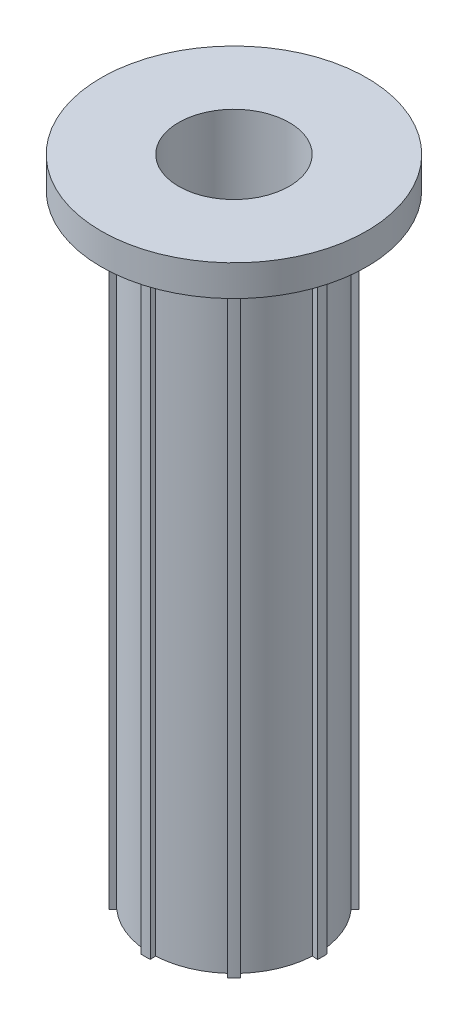
ISO-10303-21;
HEADER;
FILE_DESCRIPTION(('STEP AP214'),'2;1');
FILE_NAME('part.step','',(''),(''),'','','');
FILE_SCHEMA(('AUTOMOTIVE_DESIGN { 1 0 10303 214 1 1 1 1 }'));
ENDSEC;
DATA;
#1=APPLICATION_CONTEXT('core data for automotive mechanical design processes');
#2=APPLICATION_PROTOCOL_DEFINITION('international standard','automotive_design',2000,#1);
#3=PRODUCT_CONTEXT('',#1,'mechanical');
#4=PRODUCT('Part','Part','',(#3));
#5=PRODUCT_RELATED_PRODUCT_CATEGORY('part','',(#4));
#6=PRODUCT_DEFINITION_FORMATION('','',#4);
#7=PRODUCT_DEFINITION_CONTEXT('part definition',#1,'design');
#8=PRODUCT_DEFINITION('design','',#6,#7);
#9=PRODUCT_DEFINITION_SHAPE('','',#8);
#10=(LENGTH_UNIT() NAMED_UNIT(*) SI_UNIT(.MILLI.,.METRE.));
#11=(NAMED_UNIT(*) PLANE_ANGLE_UNIT() SI_UNIT($,.RADIAN.));
#12=(NAMED_UNIT(*) SI_UNIT($,.STERADIAN.) SOLID_ANGLE_UNIT());
#13=UNCERTAINTY_MEASURE_WITH_UNIT(LENGTH_MEASURE(1.E-05),#10,'distance_accuracy_value','');
#14=(GEOMETRIC_REPRESENTATION_CONTEXT(3) GLOBAL_UNCERTAINTY_ASSIGNED_CONTEXT((#13)) GLOBAL_UNIT_ASSIGNED_CONTEXT((#10,
#11,#12)) REPRESENTATION_CONTEXT('',''));
#15=CARTESIAN_POINT('',(0.,0.,0.));
#16=DIRECTION('',(0.,0.,1.));
#17=DIRECTION('',(1.,0.,0.));
#18=AXIS2_PLACEMENT_3D('',#15,#16,#17);
#19=CARTESIAN_POINT('',(0.,35.56,0.));
#20=DIRECTION('',(0.,-1.,0.));
#21=DIRECTION('',(0.,0.,-1.));
#22=AXIS2_PLACEMENT_3D('',#19,#20,#21);
#23=CYLINDRICAL_SURFACE('',#22,5.08);
#24=DIRECTION('',(0.,-1.,0.));
#25=VECTOR('',#24,1.);
#26=CARTESIAN_POINT('',(-3.39541124517394,35.56,3.77856883967281));
#27=LINE('',#26,#25);
#28=CARTESIAN_POINT('',(-3.39541124517394,35.56,3.77856883967281));
#29=VERTEX_POINT('',#28);
#30=CARTESIAN_POINT('',(-3.39541124517394,0.,3.77856883967281));
#31=VERTEX_POINT('',#30);
#32=EDGE_CURVE('E564',#29,#31,#27,.T.);
#33=ORIENTED_EDGE('',*,*,#32,.F.);
#34=CARTESIAN_POINT('',(0.,35.56,0.));
#35=DIRECTION('',(0.,1.,0.));
#36=DIRECTION('',(0.,0.,1.));
#37=AXIS2_PLACEMENT_3D('',#34,#35,#36);
#38=CIRCLE('',#37,5.08);
#39=CARTESIAN_POINT('',(-3.77856883967289,35.56,3.39541124517386));
#40=VERTEX_POINT('',#39);
#41=EDGE_CURVE('E308',#40,#29,#38,.T.);
#42=ORIENTED_EDGE('',*,*,#41,.F.);
#43=DIRECTION('',(0.,-1.,0.));
#44=VECTOR('',#43,1.);
#45=CARTESIAN_POINT('',(-3.77856883967289,35.56,3.39541124517386));
#46=LINE('',#45,#44);
#47=CARTESIAN_POINT('',(-3.77856883967289,0.,3.39541124517386));
#48=VERTEX_POINT('',#47);
#49=EDGE_CURVE('E339',#40,#48,#46,.T.);
#50=ORIENTED_EDGE('',*,*,#49,.T.);
#51=CARTESIAN_POINT('',(0.,0.,0.));
#52=DIRECTION('',(0.,1.,0.));
#53=DIRECTION('',(0.,0.,1.));
#54=AXIS2_PLACEMENT_3D('',#51,#52,#53);
#55=CIRCLE('',#54,5.08);
#56=EDGE_CURVE('E282',#48,#31,#55,.T.);
#57=ORIENTED_EDGE('',*,*,#56,.T.);
#58=EDGE_LOOP('',(#33,#42,#50,#57));
#59=FACE_BOUND('',#58,.T.);
#60=ADVANCED_FACE('F43',(#59),#23,.T.);
#61=DIRECTION('',(0.,-1.,0.));
#62=VECTOR('',#61,1.);
#63=CARTESIAN_POINT('',(-5.07276996609238,35.56,0.270933333333333));
#64=LINE('',#63,#62);
#65=CARTESIAN_POINT('',(-5.07276996609238,35.56,0.270933333333333));
#66=VERTEX_POINT('',#65);
#67=CARTESIAN_POINT('',(-5.07276996609238,0.,0.270933333333333));
#68=VERTEX_POINT('',#67);
#69=EDGE_CURVE('E463',#66,#68,#64,.T.);
#70=ORIENTED_EDGE('',*,*,#69,.F.);
#71=CARTESIAN_POINT('',(-5.07276996609238,35.56,-0.270933333333333));
#72=VERTEX_POINT('',#71);
#73=EDGE_CURVE('E273',#72,#66,#38,.T.);
#74=ORIENTED_EDGE('',*,*,#73,.F.);
#75=DIRECTION('',(0.,-1.,0.));
#76=VECTOR('',#75,1.);
#77=CARTESIAN_POINT('',(-5.07276996609238,35.56,-0.270933333333333));
#78=LINE('',#77,#76);
#79=CARTESIAN_POINT('',(-5.07276996609238,0.,-0.270933333333333));
#80=VERTEX_POINT('',#79);
#81=EDGE_CURVE('E260',#72,#80,#78,.T.);
#82=ORIENTED_EDGE('',*,*,#81,.T.);
#83=EDGE_CURVE('E275',#80,#68,#55,.T.);
#84=ORIENTED_EDGE('',*,*,#83,.T.);
#85=EDGE_LOOP('',(#70,#74,#82,#84));
#86=FACE_BOUND('',#85,.T.);
#87=ADVANCED_FACE('F271',(#86),#23,.T.);
#88=DIRECTION('',(0.,-1.,0.));
#89=VECTOR('',#88,1.);
#90=CARTESIAN_POINT('',(-0.270933333333333,35.56,-5.07276996609238));
#91=LINE('',#90,#89);
#92=CARTESIAN_POINT('',(-0.270933333333333,35.56,-5.07276996609238));
#93=VERTEX_POINT('',#92);
#94=CARTESIAN_POINT('',(-0.270933333333333,0.,-5.07276996609238));
#95=VERTEX_POINT('',#94);
#96=EDGE_CURVE('E324',#93,#95,#91,.T.);
#97=ORIENTED_EDGE('',*,*,#96,.F.);
#98=CARTESIAN_POINT('',(0.270933333333333,35.56,-5.07276996609238));
#99=VERTEX_POINT('',#98);
#100=EDGE_CURVE('E655',#99,#93,#38,.T.);
#101=ORIENTED_EDGE('',*,*,#100,.F.);
#102=DIRECTION('',(0.,-1.,0.));
#103=VECTOR('',#102,1.);
#104=CARTESIAN_POINT('',(0.270933333333333,35.56,-5.07276996609238));
#105=LINE('',#104,#103);
#106=CARTESIAN_POINT('',(0.270933333333333,0.,-5.07276996609238));
#107=VERTEX_POINT('',#106);
#108=EDGE_CURVE('E330',#99,#107,#105,.T.);
#109=ORIENTED_EDGE('',*,*,#108,.T.);
#110=EDGE_CURVE('E283',#107,#95,#55,.T.);
#111=ORIENTED_EDGE('',*,*,#110,.T.);
#112=EDGE_LOOP('',(#97,#101,#109,#111));
#113=FACE_BOUND('',#112,.T.);
#114=ADVANCED_FACE('F323',(#113),#23,.T.);
#115=DIRECTION('',(0.,-1.,0.));
#116=VECTOR('',#115,1.);
#117=CARTESIAN_POINT('',(3.39541124517386,35.56,-3.77856883967289));
#118=LINE('',#117,#116);
#119=CARTESIAN_POINT('',(3.39541124517386,35.56,-3.77856883967289));
#120=VERTEX_POINT('',#119);
#121=CARTESIAN_POINT('',(3.39541124517386,0.,-3.77856883967289));
#122=VERTEX_POINT('',#121);
#123=EDGE_CURVE('E356',#120,#122,#118,.T.);
#124=ORIENTED_EDGE('',*,*,#123,.F.);
#125=CARTESIAN_POINT('',(3.77856883967281,35.56,-3.39541124517394));
#126=VERTEX_POINT('',#125);
#127=EDGE_CURVE('E649',#126,#120,#38,.T.);
#128=ORIENTED_EDGE('',*,*,#127,.F.);
#129=DIRECTION('',(0.,-1.,0.));
#130=VECTOR('',#129,1.);
#131=CARTESIAN_POINT('',(3.77856883967281,35.56,-3.39541124517394));
#132=LINE('',#131,#130);
#133=CARTESIAN_POINT('',(3.77856883967281,0.,-3.39541124517394));
#134=VERTEX_POINT('',#133);
#135=EDGE_CURVE('E525',#126,#134,#132,.T.);
#136=ORIENTED_EDGE('',*,*,#135,.T.);
#137=EDGE_CURVE('E306',#134,#122,#55,.T.);
#138=ORIENTED_EDGE('',*,*,#137,.T.);
#139=EDGE_LOOP('',(#124,#128,#136,#138));
#140=FACE_BOUND('',#139,.T.);
#141=ADVANCED_FACE('F845',(#140),#23,.T.);
#142=CARTESIAN_POINT('',(-3.39541124517391,35.56,-3.77856883967284));
#143=VERTEX_POINT('',#142);
#144=CARTESIAN_POINT('',(-3.77856883967286,35.56,-3.39541124517389));
#145=VERTEX_POINT('',#144);
#146=EDGE_CURVE('E496',#143,#145,#38,.T.);
#147=ORIENTED_EDGE('',*,*,#146,.F.);
#148=DIRECTION('',(0.,-1.,0.));
#149=VECTOR('',#148,1.);
#150=CARTESIAN_POINT('',(-3.39541124517391,35.56,-3.77856883967284));
#151=LINE('',#150,#149);
#152=CARTESIAN_POINT('',(-3.39541124517391,0.,-3.77856883967284));
#153=VERTEX_POINT('',#152);
#154=EDGE_CURVE('E373',#143,#153,#151,.T.);
#155=ORIENTED_EDGE('',*,*,#154,.T.);
#156=CARTESIAN_POINT('',(-3.77856883967286,0.,-3.39541124517389));
#157=VERTEX_POINT('',#156);
#158=EDGE_CURVE('E278',#153,#157,#55,.T.);
#159=ORIENTED_EDGE('',*,*,#158,.T.);
#160=DIRECTION('',(0.,-1.,0.));
#161=VECTOR('',#160,1.);
#162=CARTESIAN_POINT('',(-3.77856883967286,35.56,-3.39541124517389));
#163=LINE('',#162,#161);
#164=EDGE_CURVE('E508',#145,#157,#163,.T.);
#165=ORIENTED_EDGE('',*,*,#164,.F.);
#166=EDGE_LOOP('',(#147,#155,#159,#165));
#167=FACE_BOUND('',#166,.T.);
#168=ADVANCED_FACE('F497',(#167),#23,.T.);
#169=DIRECTION('',(0.,-1.,0.));
#170=VECTOR('',#169,1.);
#171=CARTESIAN_POINT('',(5.07276996609238,35.56,-0.270933333333333));
#172=LINE('',#171,#170);
#173=CARTESIAN_POINT('',(5.07276996609238,35.56,-0.270933333333333));
#174=VERTEX_POINT('',#173);
#175=CARTESIAN_POINT('',(5.07276996609238,0.,-0.270933333333333));
#176=VERTEX_POINT('',#175);
#177=EDGE_CURVE('E514',#174,#176,#172,.T.);
#178=ORIENTED_EDGE('',*,*,#177,.F.);
#179=CARTESIAN_POINT('',(5.07276996609238,35.56,0.270933333333333));
#180=VERTEX_POINT('',#179);
#181=EDGE_CURVE('E55',#180,#174,#38,.T.);
#182=ORIENTED_EDGE('',*,*,#181,.F.);
#183=DIRECTION('',(0.,-1.,0.));
#184=VECTOR('',#183,1.);
#185=CARTESIAN_POINT('',(5.07276996609238,35.56,0.270933333333333));
#186=LINE('',#185,#184);
#187=CARTESIAN_POINT('',(5.07276996609238,0.,0.270933333333333));
#188=VERTEX_POINT('',#187);
#189=EDGE_CURVE('E550',#180,#188,#186,.T.);
#190=ORIENTED_EDGE('',*,*,#189,.T.);
#191=EDGE_CURVE('E296',#188,#176,#55,.T.);
#192=ORIENTED_EDGE('',*,*,#191,.T.);
#193=EDGE_LOOP('',(#178,#182,#190,#192));
#194=FACE_BOUND('',#193,.T.);
#195=ADVANCED_FACE('F443',(#194),#23,.T.);
#196=DIRECTION('',(0.,-1.,0.));
#197=VECTOR('',#196,1.);
#198=CARTESIAN_POINT('',(3.77856883967284,35.56,3.39541124517391));
#199=LINE('',#198,#197);
#200=CARTESIAN_POINT('',(3.77856883967284,35.56,3.39541124517391));
#201=VERTEX_POINT('',#200);
#202=CARTESIAN_POINT('',(3.77856883967284,0.,3.39541124517391));
#203=VERTEX_POINT('',#202);
#204=EDGE_CURVE('E537',#201,#203,#199,.T.);
#205=ORIENTED_EDGE('',*,*,#204,.F.);
#206=CARTESIAN_POINT('',(3.39541124517389,35.56,3.77856883967286));
#207=VERTEX_POINT('',#206);
#208=EDGE_CURVE('E11',#207,#201,#38,.T.);
#209=ORIENTED_EDGE('',*,*,#208,.F.);
#210=DIRECTION('',(0.,-1.,0.));
#211=VECTOR('',#210,1.);
#212=CARTESIAN_POINT('',(3.39541124517389,35.56,3.77856883967286));
#213=LINE('',#212,#211);
#214=CARTESIAN_POINT('',(3.39541124517389,0.,3.77856883967286));
#215=VERTEX_POINT('',#214);
#216=EDGE_CURVE('E398',#207,#215,#213,.T.);
#217=ORIENTED_EDGE('',*,*,#216,.T.);
#218=EDGE_CURVE('E292',#215,#203,#55,.T.);
#219=ORIENTED_EDGE('',*,*,#218,.T.);
#220=EDGE_LOOP('',(#205,#209,#217,#219));
#221=FACE_BOUND('',#220,.T.);
#222=ADVANCED_FACE('F442',(#221),#23,.T.);
#223=CARTESIAN_POINT('',(-0.270933333333333,35.56,5.07276996609238));
#224=VERTEX_POINT('',#223);
#225=CARTESIAN_POINT('',(0.270933333333333,35.56,5.07276996609238));
#226=VERTEX_POINT('',#225);
#227=EDGE_CURVE('E52',#224,#226,#38,.T.);
#228=ORIENTED_EDGE('',*,*,#227,.F.);
#229=DIRECTION('',(0.,-1.,0.));
#230=VECTOR('',#229,1.);
#231=CARTESIAN_POINT('',(-0.270933333333333,35.56,5.07276996609238));
#232=LINE('',#231,#230);
#233=CARTESIAN_POINT('',(-0.270933333333333,0.,5.07276996609238));
#234=VERTEX_POINT('',#233);
#235=EDGE_CURVE('E450',#224,#234,#232,.T.);
#236=ORIENTED_EDGE('',*,*,#235,.T.);
#237=CARTESIAN_POINT('',(0.270933333333333,0.,5.07276996609238));
#238=VERTEX_POINT('',#237);
#239=EDGE_CURVE('E50',#234,#238,#55,.T.);
#240=ORIENTED_EDGE('',*,*,#239,.T.);
#241=DIRECTION('',(0.,-1.,0.));
#242=VECTOR('',#241,1.);
#243=CARTESIAN_POINT('',(0.270933333333333,35.56,5.07276996609238));
#244=LINE('',#243,#242);
#245=EDGE_CURVE('E392',#226,#238,#244,.T.);
#246=ORIENTED_EDGE('',*,*,#245,.F.);
#247=EDGE_LOOP('',(#228,#236,#240,#246));
#248=FACE_BOUND('',#247,.T.);
#249=ADVANCED_FACE('F44',(#248),#23,.T.);
#250=CARTESIAN_POINT('',(0.,0.,0.));
#251=DIRECTION('',(0.,1.,0.));
#252=DIRECTION('',(0.,0.,1.));
#253=AXIS2_PLACEMENT_3D('',#250,#251,#252);
#254=PLANE('',#253);
#255=DIRECTION('',(0.998576764978815,0.,-0.0533333333333335));
#256=VECTOR('',#255,1.);
#257=CARTESIAN_POINT('',(-4.75572184321161,0.,0.254));
#258=LINE('',#257,#256);
#259=CARTESIAN_POINT('',(-4.75572184321161,0.,0.254000000000001));
#260=VERTEX_POINT('',#259);
#261=EDGE_CURVE('E67',#68,#260,#258,.T.);
#262=ORIENTED_EDGE('',*,*,#261,.F.);
#263=ORIENTED_EDGE('',*,*,#83,.F.);
#264=DIRECTION('',(-0.998576764978815,0.,-0.0533333333333335));
#265=VECTOR('',#264,1.);
#266=CARTESIAN_POINT('',(-4.75572184321161,0.,-0.254));
#267=LINE('',#266,#265);
#268=CARTESIAN_POINT('',(-4.75572184321161,0.,-0.254));
#269=VERTEX_POINT('',#268);
#270=EDGE_CURVE('E251',#269,#80,#267,.T.);
#271=ORIENTED_EDGE('',*,*,#270,.F.);
#272=CARTESIAN_POINT('',(0.,0.,0.));
#273=DIRECTION('',(0.,1.,0.));
#274=DIRECTION('',(0.,0.,-1.));
#275=AXIS2_PLACEMENT_3D('',#272,#273,#274);
#276=CIRCLE('',#275,4.7625);
#277=CARTESIAN_POINT('',(-3.54240828719331,0.,-3.18319804235052));
#278=VERTEX_POINT('',#277);
#279=EDGE_CURVE('E262',#278,#269,#276,.T.);
#280=ORIENTED_EDGE('',*,*,#279,.F.);
#281=DIRECTION('',(0.743812763715128,0.,0.668388040388563));
#282=VECTOR('',#281,1.);
#283=CARTESIAN_POINT('',(-3.54240828719331,0.,-3.18319804235052));
#284=LINE('',#283,#282);
#285=EDGE_CURVE('E364',#157,#278,#284,.T.);
#286=ORIENTED_EDGE('',*,*,#285,.F.);
#287=ORIENTED_EDGE('',*,*,#158,.F.);
#288=DIRECTION('',(-0.668388040388563,0.,-0.743812763715128));
#289=VECTOR('',#288,1.);
#290=CARTESIAN_POINT('',(-3.18319804235054,0.,-3.54240828719328));
#291=LINE('',#290,#289);
#292=CARTESIAN_POINT('',(-3.18319804235054,0.,-3.54240828719328));
#293=VERTEX_POINT('',#292);
#294=EDGE_CURVE('E342',#293,#153,#291,.T.);
#295=ORIENTED_EDGE('',*,*,#294,.F.);
#296=CARTESIAN_POINT('',(0.,0.,0.));
#297=DIRECTION('',(0.,1.,0.));
#298=DIRECTION('',(0.,0.,-1.));
#299=AXIS2_PLACEMENT_3D('',#296,#297,#298);
#300=CIRCLE('',#299,4.7625);
#301=CARTESIAN_POINT('',(-0.254,0.,-4.75572184321161));
#302=VERTEX_POINT('',#301);
#303=EDGE_CURVE('E337',#302,#293,#300,.T.);
#304=ORIENTED_EDGE('',*,*,#303,.F.);
#305=DIRECTION('',(0.0533333333333333,0.,0.998576764978815));
#306=VECTOR('',#305,1.);
#307=CARTESIAN_POINT('',(-0.254,0.,-4.75572184321161));
#308=LINE('',#307,#306);
#309=EDGE_CURVE('E334',#95,#302,#308,.T.);
#310=ORIENTED_EDGE('',*,*,#309,.F.);
#311=ORIENTED_EDGE('',*,*,#110,.F.);
#312=DIRECTION('',(0.0533333333333335,0.,-0.998576764978815));
#313=VECTOR('',#312,1.);
#314=CARTESIAN_POINT('',(0.254,0.,-4.75572184321161));
#315=LINE('',#314,#313);
#316=CARTESIAN_POINT('',(0.254,0.,-4.75572184321161));
#317=VERTEX_POINT('',#316);
#318=EDGE_CURVE('E332',#317,#107,#315,.T.);
#319=ORIENTED_EDGE('',*,*,#318,.F.);
#320=CARTESIAN_POINT('',(0.,0.,0.));
#321=DIRECTION('',(0.,1.,0.));
#322=DIRECTION('',(0.,0.,-1.));
#323=AXIS2_PLACEMENT_3D('',#320,#321,#322);
#324=CIRCLE('',#323,4.7625);
#325=CARTESIAN_POINT('',(3.18319804235049,0.,-3.54240828719333));
#326=VERTEX_POINT('',#325);
#327=EDGE_CURVE('E370',#326,#317,#324,.T.);
#328=ORIENTED_EDGE('',*,*,#327,.F.);
#329=DIRECTION('',(-0.668388040388562,0.,0.743812763715129));
#330=VECTOR('',#329,1.);
#331=CARTESIAN_POINT('',(3.18319804235049,0.,-3.54240828719333));
#332=LINE('',#331,#330);
#333=EDGE_CURVE('E371',#122,#326,#332,.T.);
#334=ORIENTED_EDGE('',*,*,#333,.F.);
#335=ORIENTED_EDGE('',*,*,#137,.F.);
#336=DIRECTION('',(0.743812763715128,0.,-0.668388040388563));
#337=VECTOR('',#336,1.);
#338=CARTESIAN_POINT('',(3.54240828719326,0.,-3.18319804235057));
#339=LINE('',#338,#337);
#340=CARTESIAN_POINT('',(3.54240828719326,0.,-3.18319804235057));
#341=VERTEX_POINT('',#340);
#342=EDGE_CURVE('E524',#341,#134,#339,.T.);
#343=ORIENTED_EDGE('',*,*,#342,.F.);
#344=CARTESIAN_POINT('',(0.,0.,0.));
#345=DIRECTION('',(0.,1.,0.));
#346=DIRECTION('',(0.,0.,-1.));
#347=AXIS2_PLACEMENT_3D('',#344,#345,#346);
#348=CIRCLE('',#347,4.7625);
#349=CARTESIAN_POINT('',(4.75572184321161,0.,-0.254));
#350=VERTEX_POINT('',#349);
#351=EDGE_CURVE('E527',#350,#341,#348,.T.);
#352=ORIENTED_EDGE('',*,*,#351,.F.);
#353=DIRECTION('',(-0.998576764978815,0.,0.0533333333333335));
#354=VECTOR('',#353,1.);
#355=CARTESIAN_POINT('',(5.07276996609238,0.,-0.270933333333333));
#356=LINE('',#355,#354);
#357=EDGE_CURVE('E274',#176,#350,#356,.T.);
#358=ORIENTED_EDGE('',*,*,#357,.F.);
#359=ORIENTED_EDGE('',*,*,#191,.F.);
#360=DIRECTION('',(0.998576764978815,0.,0.0533333333333335));
#361=VECTOR('',#360,1.);
#362=CARTESIAN_POINT('',(5.07276996609238,0.,0.270933333333333));
#363=LINE('',#362,#361);
#364=CARTESIAN_POINT('',(4.75572184321161,0.,0.254));
#365=VERTEX_POINT('',#364);
#366=EDGE_CURVE('E548',#365,#188,#363,.T.);
#367=ORIENTED_EDGE('',*,*,#366,.F.);
#368=CARTESIAN_POINT('',(0.,0.,0.));
#369=DIRECTION('',(0.,1.,0.));
#370=DIRECTION('',(0.,0.,-1.));
#371=AXIS2_PLACEMENT_3D('',#368,#369,#370);
#372=CIRCLE('',#371,4.7625);
#373=CARTESIAN_POINT('',(3.54240828719329,0.,3.18319804235054));
#374=VERTEX_POINT('',#373);
#375=EDGE_CURVE('E552',#374,#365,#372,.T.);
#376=ORIENTED_EDGE('',*,*,#375,.F.);
#377=DIRECTION('',(-0.743812763715128,0.,-0.668388040388563));
#378=VECTOR('',#377,1.);
#379=CARTESIAN_POINT('',(3.77856883967284,0.,3.39541124517391));
#380=LINE('',#379,#378);
#381=EDGE_CURVE('E523',#203,#374,#380,.T.);
#382=ORIENTED_EDGE('',*,*,#381,.F.);
#383=ORIENTED_EDGE('',*,*,#218,.F.);
#384=DIRECTION('',(0.668388040388563,0.,0.743812763715128));
#385=VECTOR('',#384,1.);
#386=CARTESIAN_POINT('',(3.39541124517389,0.,3.77856883967286));
#387=LINE('',#386,#385);
#388=CARTESIAN_POINT('',(3.18319804235052,0.,3.54240828719331));
#389=VERTEX_POINT('',#388);
#390=EDGE_CURVE('E384',#389,#215,#387,.T.);
#391=ORIENTED_EDGE('',*,*,#390,.F.);
#392=CARTESIAN_POINT('',(0.,0.,0.));
#393=DIRECTION('',(0.,1.,0.));
#394=DIRECTION('',(0.,0.,-1.));
#395=AXIS2_PLACEMENT_3D('',#392,#393,#394);
#396=CIRCLE('',#395,4.7625);
#397=CARTESIAN_POINT('',(0.254,0.,4.75572184321161));
#398=VERTEX_POINT('',#397);
#399=EDGE_CURVE('E394',#398,#389,#396,.T.);
#400=ORIENTED_EDGE('',*,*,#399,.F.);
#401=DIRECTION('',(-0.0533333333333334,0.,-0.998576764978815));
#402=VECTOR('',#401,1.);
#403=CARTESIAN_POINT('',(0.270933333333333,0.,5.07276996609238));
#404=LINE('',#403,#402);
#405=EDGE_CURVE('E395',#238,#398,#404,.T.);
#406=ORIENTED_EDGE('',*,*,#405,.F.);
#407=ORIENTED_EDGE('',*,*,#239,.F.);
#408=DIRECTION('',(-0.0533333333333334,0.,0.998576764978815));
#409=VECTOR('',#408,1.);
#410=CARTESIAN_POINT('',(-0.270933333333333,0.,5.07276996609238));
#411=LINE('',#410,#409);
#412=CARTESIAN_POINT('',(-0.254,0.,4.75572184321161));
#413=VERTEX_POINT('',#412);
#414=EDGE_CURVE('E569',#413,#234,#411,.T.);
#415=ORIENTED_EDGE('',*,*,#414,.F.);
#416=CARTESIAN_POINT('',(0.,0.,0.));
#417=DIRECTION('',(0.,1.,0.));
#418=DIRECTION('',(0.,0.,-1.));
#419=AXIS2_PLACEMENT_3D('',#416,#417,#418);
#420=CIRCLE('',#419,4.7625);
#421=CARTESIAN_POINT('',(-3.18319804235057,0.,3.54240828719326));
#422=VERTEX_POINT('',#421);
#423=EDGE_CURVE('E391',#422,#413,#420,.T.);
#424=ORIENTED_EDGE('',*,*,#423,.F.);
#425=DIRECTION('',(0.668388040388563,0.,-0.743812763715127));
#426=VECTOR('',#425,1.);
#427=CARTESIAN_POINT('',(-3.39541124517394,0.,3.77856883967281));
#428=LINE('',#427,#426);
#429=EDGE_CURVE('E58',#31,#422,#428,.T.);
#430=ORIENTED_EDGE('',*,*,#429,.F.);
#431=ORIENTED_EDGE('',*,*,#56,.F.);
#432=DIRECTION('',(-0.743812763715128,0.,0.668388040388563));
#433=VECTOR('',#432,1.);
#434=CARTESIAN_POINT('',(-3.77856883967289,0.,3.39541124517386));
#435=LINE('',#434,#433);
#436=CARTESIAN_POINT('',(-3.54240828719333,0.,3.18319804235049));
#437=VERTEX_POINT('',#436);
#438=EDGE_CURVE('E468',#437,#48,#435,.T.);
#439=ORIENTED_EDGE('',*,*,#438,.F.);
#440=CARTESIAN_POINT('',(0.,0.,0.));
#441=DIRECTION('',(0.,1.,0.));
#442=DIRECTION('',(0.,0.,-1.));
#443=AXIS2_PLACEMENT_3D('',#440,#441,#442);
#444=CIRCLE('',#443,4.7625);
#445=EDGE_CURVE('E473',#260,#437,#444,.T.);
#446=ORIENTED_EDGE('',*,*,#445,.F.);
#447=EDGE_LOOP('',(#262,#263,#271,#280,#286,#287,#295,#304,#310,#311,#319,#328,#334,#335,#343,
#352,#358,#359,#367,#376,#382,#383,#391,#400,#406,#407,#415,#424,#430,#431,#439,#446));
#448=FACE_BOUND('',#447,.T.);
#449=CARTESIAN_POINT('',(0.,0.,0.));
#450=DIRECTION('',(0.,1.,0.));
#451=DIRECTION('',(0.,0.,1.));
#452=AXIS2_PLACEMENT_3D('',#449,#450,#451);
#453=CIRCLE('',#452,3.175);
#454=CARTESIAN_POINT('',(0.,0.,3.175));
#455=VERTEX_POINT('',#454);
#456=EDGE_CURVE('E408',#455,#455,#453,.T.);
#457=ORIENTED_EDGE('',*,*,#456,.T.);
#458=EDGE_LOOP('',(#457));
#459=FACE_BOUND('',#458,.T.);
#460=ADVANCED_FACE('F280',(#448,#459),#254,.F.);
#461=CARTESIAN_POINT('',(0.,37.338,0.));
#462=DIRECTION('',(0.,-1.,0.));
#463=DIRECTION('',(0.,0.,-1.));
#464=AXIS2_PLACEMENT_3D('',#461,#462,#463);
#465=CYLINDRICAL_SURFACE('',#464,7.62);
#466=CARTESIAN_POINT('',(0.,37.338,0.));
#467=DIRECTION('',(0.,1.,0.));
#468=DIRECTION('',(0.,0.,1.));
#469=AXIS2_PLACEMENT_3D('',#466,#467,#468);
#470=CIRCLE('',#469,7.62);
#471=CARTESIAN_POINT('',(0.,37.338,7.62));
#472=VERTEX_POINT('',#471);
#473=EDGE_CURVE('E289',#472,#472,#470,.T.);
#474=ORIENTED_EDGE('',*,*,#473,.F.);
#475=EDGE_LOOP('',(#474));
#476=FACE_BOUND('',#475,.T.);
#477=CARTESIAN_POINT('',(0.,35.56,0.));
#478=DIRECTION('',(0.,1.,0.));
#479=DIRECTION('',(0.,0.,1.));
#480=AXIS2_PLACEMENT_3D('',#477,#478,#479);
#481=CIRCLE('',#480,7.62);
#482=CARTESIAN_POINT('',(0.,35.56,7.62));
#483=VERTEX_POINT('',#482);
#484=EDGE_CURVE('E300',#483,#483,#481,.T.);
#485=ORIENTED_EDGE('',*,*,#484,.T.);
#486=EDGE_LOOP('',(#485));
#487=FACE_BOUND('',#486,.T.);
#488=ADVANCED_FACE('F418',(#476,#487),#465,.T.);
#489=CARTESIAN_POINT('',(0.,37.338,0.));
#490=DIRECTION('',(0.,1.,0.));
#491=DIRECTION('',(0.,0.,1.));
#492=AXIS2_PLACEMENT_3D('',#489,#490,#491);
#493=PLANE('',#492);
#494=CARTESIAN_POINT('',(0.,37.338,0.));
#495=DIRECTION('',(0.,1.,0.));
#496=DIRECTION('',(0.,0.,1.));
#497=AXIS2_PLACEMENT_3D('',#494,#495,#496);
#498=CIRCLE('',#497,3.175);
#499=CARTESIAN_POINT('',(0.,37.338,3.175));
#500=VERTEX_POINT('',#499);
#501=EDGE_CURVE('E402',#500,#500,#498,.T.);
#502=ORIENTED_EDGE('',*,*,#501,.F.);
#503=EDGE_LOOP('',(#502));
#504=FACE_BOUND('',#503,.T.);
#505=ORIENTED_EDGE('',*,*,#473,.T.);
#506=EDGE_LOOP('',(#505));
#507=FACE_BOUND('',#506,.T.);
#508=ADVANCED_FACE('F423',(#504,#507),#493,.T.);
#509=CARTESIAN_POINT('',(0.,35.56,0.));
#510=DIRECTION('',(0.,1.,0.));
#511=DIRECTION('',(0.,0.,1.));
#512=AXIS2_PLACEMENT_3D('',#509,#510,#511);
#513=PLANE('',#512);
#514=ORIENTED_EDGE('',*,*,#227,.T.);
#515=DIRECTION('',(-0.0533333333333334,0.,-0.998576764978815));
#516=VECTOR('',#515,1.);
#517=CARTESIAN_POINT('',(0.270933333333333,35.56,5.07276996609238));
#518=LINE('',#517,#516);
#519=CARTESIAN_POINT('',(0.254,35.56,4.75572184321161));
#520=VERTEX_POINT('',#519);
#521=EDGE_CURVE('E381',#226,#520,#518,.T.);
#522=ORIENTED_EDGE('',*,*,#521,.T.);
#523=CARTESIAN_POINT('',(0.,35.56,0.));
#524=DIRECTION('',(0.,1.,0.));
#525=DIRECTION('',(0.,0.,-1.));
#526=AXIS2_PLACEMENT_3D('',#523,#524,#525);
#527=CIRCLE('',#526,4.7625);
#528=CARTESIAN_POINT('',(3.18319804235052,35.56,3.54240828719331));
#529=VERTEX_POINT('',#528);
#530=EDGE_CURVE('E383',#520,#529,#527,.T.);
#531=ORIENTED_EDGE('',*,*,#530,.T.);
#532=DIRECTION('',(0.668388040388563,0.,0.743812763715128));
#533=VECTOR('',#532,1.);
#534=CARTESIAN_POINT('',(3.39541124517389,35.56,3.77856883967286));
#535=LINE('',#534,#533);
#536=EDGE_CURVE('E389',#529,#207,#535,.T.);
#537=ORIENTED_EDGE('',*,*,#536,.T.);
#538=ORIENTED_EDGE('',*,*,#208,.T.);
#539=DIRECTION('',(-0.743812763715128,0.,-0.668388040388563));
#540=VECTOR('',#539,1.);
#541=CARTESIAN_POINT('',(3.77856883967284,35.56,3.39541124517391));
#542=LINE('',#541,#540);
#543=CARTESIAN_POINT('',(3.54240828719329,35.56,3.18319804235054));
#544=VERTEX_POINT('',#543);
#545=EDGE_CURVE('E555',#201,#544,#542,.T.);
#546=ORIENTED_EDGE('',*,*,#545,.T.);
#547=CARTESIAN_POINT('',(0.,35.56,0.));
#548=DIRECTION('',(0.,1.,0.));
#549=DIRECTION('',(0.,0.,-1.));
#550=AXIS2_PLACEMENT_3D('',#547,#548,#549);
#551=CIRCLE('',#550,4.7625);
#552=CARTESIAN_POINT('',(4.75572184321161,35.56,0.254));
#553=VERTEX_POINT('',#552);
#554=EDGE_CURVE('E558',#544,#553,#551,.T.);
#555=ORIENTED_EDGE('',*,*,#554,.T.);
#556=DIRECTION('',(0.998576764978815,0.,0.0533333333333335));
#557=VECTOR('',#556,1.);
#558=CARTESIAN_POINT('',(5.07276996609238,35.56,0.270933333333333));
#559=LINE('',#558,#557);
#560=EDGE_CURVE('E541',#553,#180,#559,.T.);
#561=ORIENTED_EDGE('',*,*,#560,.T.);
#562=ORIENTED_EDGE('',*,*,#181,.T.);
#563=DIRECTION('',(-0.998576764978815,0.,0.0533333333333335));
#564=VECTOR('',#563,1.);
#565=CARTESIAN_POINT('',(5.07276996609238,35.56,-0.270933333333333));
#566=LINE('',#565,#564);
#567=CARTESIAN_POINT('',(4.75572184321161,35.56,-0.254));
#568=VERTEX_POINT('',#567);
#569=EDGE_CURVE('E526',#174,#568,#566,.T.);
#570=ORIENTED_EDGE('',*,*,#569,.T.);
#571=CARTESIAN_POINT('',(0.,35.56,0.));
#572=DIRECTION('',(0.,1.,0.));
#573=DIRECTION('',(0.,0.,-1.));
#574=AXIS2_PLACEMENT_3D('',#571,#572,#573);
#575=CIRCLE('',#574,4.7625);
#576=CARTESIAN_POINT('',(3.54240828719326,35.56,-3.18319804235057));
#577=VERTEX_POINT('',#576);
#578=EDGE_CURVE('E534',#568,#577,#575,.T.);
#579=ORIENTED_EDGE('',*,*,#578,.T.);
#580=DIRECTION('',(0.743812763715128,0.,-0.668388040388563));
#581=VECTOR('',#580,1.);
#582=CARTESIAN_POINT('',(3.54240828719326,35.56,-3.18319804235057));
#583=LINE('',#582,#581);
#584=EDGE_CURVE('E517',#577,#126,#583,.T.);
#585=ORIENTED_EDGE('',*,*,#584,.T.);
#586=ORIENTED_EDGE('',*,*,#127,.T.);
#587=DIRECTION('',(-0.668388040388562,0.,0.743812763715129));
#588=VECTOR('',#587,1.);
#589=CARTESIAN_POINT('',(3.18319804235049,35.56,-3.54240828719333));
#590=LINE('',#589,#588);
#591=CARTESIAN_POINT('',(3.18319804235049,35.56,-3.54240828719333));
#592=VERTEX_POINT('',#591);
#593=EDGE_CURVE('E366',#120,#592,#590,.T.);
#594=ORIENTED_EDGE('',*,*,#593,.T.);
#595=CARTESIAN_POINT('',(0.,35.56,0.));
#596=DIRECTION('',(0.,1.,0.));
#597=DIRECTION('',(0.,0.,-1.));
#598=AXIS2_PLACEMENT_3D('',#595,#596,#597);
#599=CIRCLE('',#598,4.7625);
#600=CARTESIAN_POINT('',(0.254,35.56,-4.75572184321161));
#601=VERTEX_POINT('',#600);
#602=EDGE_CURVE('E376',#592,#601,#599,.T.);
#603=ORIENTED_EDGE('',*,*,#602,.T.);
#604=DIRECTION('',(0.0533333333333335,0.,-0.998576764978815));
#605=VECTOR('',#604,1.);
#606=CARTESIAN_POINT('',(0.254,35.56,-4.75572184321161));
#607=LINE('',#606,#605);
#608=EDGE_CURVE('E357',#601,#99,#607,.T.);
#609=ORIENTED_EDGE('',*,*,#608,.T.);
#610=ORIENTED_EDGE('',*,*,#100,.T.);
#611=DIRECTION('',(0.0533333333333333,0.,0.998576764978815));
#612=VECTOR('',#611,1.);
#613=CARTESIAN_POINT('',(-0.254,35.56,-4.75572184321161));
#614=LINE('',#613,#612);
#615=CARTESIAN_POINT('',(-0.254,35.56,-4.75572184321161));
#616=VERTEX_POINT('',#615);
#617=EDGE_CURVE('E353',#93,#616,#614,.T.);
#618=ORIENTED_EDGE('',*,*,#617,.T.);
#619=CARTESIAN_POINT('',(0.,35.56,0.));
#620=DIRECTION('',(0.,1.,0.));
#621=DIRECTION('',(0.,0.,-1.));
#622=AXIS2_PLACEMENT_3D('',#619,#620,#621);
#623=CIRCLE('',#622,4.7625);
#624=CARTESIAN_POINT('',(-3.18319804235054,35.56,-3.54240828719328));
#625=VERTEX_POINT('',#624);
#626=EDGE_CURVE('E348',#616,#625,#623,.T.);
#627=ORIENTED_EDGE('',*,*,#626,.T.);
#628=DIRECTION('',(-0.668388040388563,0.,-0.743812763715128));
#629=VECTOR('',#628,1.);
#630=CARTESIAN_POINT('',(-3.18319804235054,35.56,-3.54240828719328));
#631=LINE('',#630,#629);
#632=EDGE_CURVE('E350',#625,#143,#631,.T.);
#633=ORIENTED_EDGE('',*,*,#632,.T.);
#634=ORIENTED_EDGE('',*,*,#146,.T.);
#635=DIRECTION('',(0.743812763715128,0.,0.668388040388563));
#636=VECTOR('',#635,1.);
#637=CARTESIAN_POINT('',(-3.54240828719331,35.56,-3.18319804235052));
#638=LINE('',#637,#636);
#639=CARTESIAN_POINT('',(-3.54240828719331,35.56,-3.18319804235052));
#640=VERTEX_POINT('',#639);
#641=EDGE_CURVE('E264',#145,#640,#638,.T.);
#642=ORIENTED_EDGE('',*,*,#641,.T.);
#643=CARTESIAN_POINT('',(0.,35.56,0.));
#644=DIRECTION('',(0.,1.,0.));
#645=DIRECTION('',(0.,0.,-1.));
#646=AXIS2_PLACEMENT_3D('',#643,#644,#645);
#647=CIRCLE('',#646,4.7625);
#648=CARTESIAN_POINT('',(-4.75572184321161,35.56,-0.254));
#649=VERTEX_POINT('',#648);
#650=EDGE_CURVE('E507',#640,#649,#647,.T.);
#651=ORIENTED_EDGE('',*,*,#650,.T.);
#652=DIRECTION('',(-0.998576764978815,0.,-0.0533333333333335));
#653=VECTOR('',#652,1.);
#654=CARTESIAN_POINT('',(-4.75572184321161,35.56,-0.254));
#655=LINE('',#654,#653);
#656=EDGE_CURVE('E506',#649,#72,#655,.T.);
#657=ORIENTED_EDGE('',*,*,#656,.T.);
#658=ORIENTED_EDGE('',*,*,#73,.T.);
#659=DIRECTION('',(0.998576764978815,0.,-0.0533333333333335));
#660=VECTOR('',#659,1.);
#661=CARTESIAN_POINT('',(-4.75572184321161,35.56,0.254));
#662=LINE('',#661,#660);
#663=CARTESIAN_POINT('',(-4.75572184321161,35.56,0.254000000000001));
#664=VERTEX_POINT('',#663);
#665=EDGE_CURVE('E472',#66,#664,#662,.T.);
#666=ORIENTED_EDGE('',*,*,#665,.T.);
#667=CARTESIAN_POINT('',(0.,35.56,0.));
#668=DIRECTION('',(0.,1.,0.));
#669=DIRECTION('',(0.,0.,-1.));
#670=AXIS2_PLACEMENT_3D('',#667,#668,#669);
#671=CIRCLE('',#670,4.7625);
#672=CARTESIAN_POINT('',(-3.54240828719333,35.56,3.18319804235049));
#673=VERTEX_POINT('',#672);
#674=EDGE_CURVE('E479',#664,#673,#671,.T.);
#675=ORIENTED_EDGE('',*,*,#674,.T.);
#676=DIRECTION('',(-0.743812763715128,0.,0.668388040388563));
#677=VECTOR('',#676,1.);
#678=CARTESIAN_POINT('',(-3.77856883967289,35.56,3.39541124517386));
#679=LINE('',#678,#677);
#680=EDGE_CURVE('E461',#673,#40,#679,.T.);
#681=ORIENTED_EDGE('',*,*,#680,.T.);
#682=ORIENTED_EDGE('',*,*,#41,.T.);
#683=DIRECTION('',(0.668388040388563,0.,-0.743812763715127));
#684=VECTOR('',#683,1.);
#685=CARTESIAN_POINT('',(-3.39541124517394,35.56,3.77856883967281));
#686=LINE('',#685,#684);
#687=CARTESIAN_POINT('',(-3.18319804235057,35.56,3.54240828719326));
#688=VERTEX_POINT('',#687);
#689=EDGE_CURVE('E457',#29,#688,#686,.T.);
#690=ORIENTED_EDGE('',*,*,#689,.T.);
#691=CARTESIAN_POINT('',(0.,35.56,0.));
#692=DIRECTION('',(0.,1.,0.));
#693=DIRECTION('',(0.,0.,-1.));
#694=AXIS2_PLACEMENT_3D('',#691,#692,#693);
#695=CIRCLE('',#694,4.7625);
#696=CARTESIAN_POINT('',(-0.254,35.56,4.75572184321161));
#697=VERTEX_POINT('',#696);
#698=EDGE_CURVE('E453',#688,#697,#695,.T.);
#699=ORIENTED_EDGE('',*,*,#698,.T.);
#700=DIRECTION('',(-0.0533333333333334,0.,0.998576764978815));
#701=VECTOR('',#700,1.);
#702=CARTESIAN_POINT('',(-0.270933333333333,35.56,5.07276996609238));
#703=LINE('',#702,#701);
#704=EDGE_CURVE('E451',#697,#224,#703,.T.);
#705=ORIENTED_EDGE('',*,*,#704,.T.);
#706=EDGE_LOOP('',(#514,#522,#531,#537,#538,#546,#555,#561,#562,#570,#579,#585,#586,#594,#603,
#609,#610,#618,#627,#633,#634,#642,#651,#657,#658,#666,#675,#681,#682,#690,#699,#705));
#707=FACE_BOUND('',#706,.T.);
#708=ORIENTED_EDGE('',*,*,#484,.F.);
#709=EDGE_LOOP('',(#708));
#710=FACE_BOUND('',#709,.T.);
#711=ADVANCED_FACE('F416',(#707,#710),#513,.F.);
#712=CARTESIAN_POINT('',(0.,0.,0.));
#713=DIRECTION('',(0.,1.,0.));
#714=DIRECTION('',(0.,0.,1.));
#715=AXIS2_PLACEMENT_3D('',#712,#713,#714);
#716=CYLINDRICAL_SURFACE('',#715,3.175);
#717=ORIENTED_EDGE('',*,*,#456,.F.);
#718=EDGE_LOOP('',(#717));
#719=FACE_BOUND('',#718,.T.);
#720=ORIENTED_EDGE('',*,*,#501,.T.);
#721=EDGE_LOOP('',(#720));
#722=FACE_BOUND('',#721,.T.);
#723=ADVANCED_FACE('F419',(#719,#722),#716,.F.);
#724=CARTESIAN_POINT('',(3.39541124517389,35.56,3.77856883967286));
#725=DIRECTION('',(0.743812763715128,0.,-0.668388040388563));
#726=DIRECTION('',(-0.668388040388563,0.,-0.743812763715128));
#727=AXIS2_PLACEMENT_3D('',#724,#725,#726);
#728=PLANE('',#727);
#729=ORIENTED_EDGE('',*,*,#390,.T.);
#730=ORIENTED_EDGE('',*,*,#216,.F.);
#731=ORIENTED_EDGE('',*,*,#536,.F.);
#732=DIRECTION('',(0.,-1.,0.));
#733=VECTOR('',#732,1.);
#734=CARTESIAN_POINT('',(3.18319804235052,35.56,3.54240828719331));
#735=LINE('',#734,#733);
#736=EDGE_CURVE('E405',#529,#389,#735,.T.);
#737=ORIENTED_EDGE('',*,*,#736,.T.);
#738=EDGE_LOOP('',(#729,#730,#731,#737));
#739=FACE_BOUND('',#738,.T.);
#740=ADVANCED_FACE('F427',(#739),#728,.F.);
#741=CARTESIAN_POINT('',(0.,35.56,0.));
#742=DIRECTION('',(0.,-1.,0.));
#743=DIRECTION('',(0.,0.,-1.));
#744=AXIS2_PLACEMENT_3D('',#741,#742,#743);
#745=CYLINDRICAL_SURFACE('',#744,4.7625);
#746=ORIENTED_EDGE('',*,*,#399,.T.);
#747=ORIENTED_EDGE('',*,*,#736,.F.);
#748=ORIENTED_EDGE('',*,*,#530,.F.);
#749=DIRECTION('',(0.,-1.,0.));
#750=VECTOR('',#749,1.);
#751=CARTESIAN_POINT('',(0.254,35.56,4.75572184321161));
#752=LINE('',#751,#750);
#753=EDGE_CURVE('E404',#520,#398,#752,.T.);
#754=ORIENTED_EDGE('',*,*,#753,.T.);
#755=EDGE_LOOP('',(#746,#747,#748,#754));
#756=FACE_BOUND('',#755,.T.);
#757=ADVANCED_FACE('F622',(#756),#745,.T.);
#758=CARTESIAN_POINT('',(0.270933333333333,35.56,5.07276996609238));
#759=DIRECTION('',(-0.998576764978815,0.,0.0533333333333334));
#760=DIRECTION('',(0.0533333333333334,0.,0.998576764978815));
#761=AXIS2_PLACEMENT_3D('',#758,#759,#760);
#762=PLANE('',#761);
#763=ORIENTED_EDGE('',*,*,#405,.T.);
#764=ORIENTED_EDGE('',*,*,#753,.F.);
#765=ORIENTED_EDGE('',*,*,#521,.F.);
#766=ORIENTED_EDGE('',*,*,#245,.T.);
#767=EDGE_LOOP('',(#763,#764,#765,#766));
#768=FACE_BOUND('',#767,.T.);
#769=ADVANCED_FACE('F623',(#768),#762,.F.);
#770=CARTESIAN_POINT('',(5.07276996609238,35.56,0.270933333333333));
#771=DIRECTION('',(0.0533333333333335,0.,-0.998576764978815));
#772=DIRECTION('',(-0.998576764978815,0.,-0.0533333333333335));
#773=AXIS2_PLACEMENT_3D('',#770,#771,#772);
#774=PLANE('',#773);
#775=ORIENTED_EDGE('',*,*,#366,.T.);
#776=ORIENTED_EDGE('',*,*,#189,.F.);
#777=ORIENTED_EDGE('',*,*,#560,.F.);
#778=DIRECTION('',(0.,-1.,0.));
#779=VECTOR('',#778,1.);
#780=CARTESIAN_POINT('',(4.75572184321161,35.56,0.254));
#781=LINE('',#780,#779);
#782=EDGE_CURVE('E544',#553,#365,#781,.T.);
#783=ORIENTED_EDGE('',*,*,#782,.T.);
#784=EDGE_LOOP('',(#775,#776,#777,#783));
#785=FACE_BOUND('',#784,.T.);
#786=ADVANCED_FACE('F628',(#785),#774,.F.);
#787=CARTESIAN_POINT('',(0.,35.56,0.));
#788=DIRECTION('',(0.,-1.,0.));
#789=DIRECTION('',(0.,0.,-1.));
#790=AXIS2_PLACEMENT_3D('',#787,#788,#789);
#791=CYLINDRICAL_SURFACE('',#790,4.7625);
#792=ORIENTED_EDGE('',*,*,#375,.T.);
#793=ORIENTED_EDGE('',*,*,#782,.F.);
#794=ORIENTED_EDGE('',*,*,#554,.F.);
#795=DIRECTION('',(0.,-1.,0.));
#796=VECTOR('',#795,1.);
#797=CARTESIAN_POINT('',(3.54240828719329,35.56,3.18319804235054));
#798=LINE('',#797,#796);
#799=EDGE_CURVE('E545',#544,#374,#798,.T.);
#800=ORIENTED_EDGE('',*,*,#799,.T.);
#801=EDGE_LOOP('',(#792,#793,#794,#800));
#802=FACE_BOUND('',#801,.T.);
#803=ADVANCED_FACE('F632',(#802),#791,.T.);
#804=CARTESIAN_POINT('',(3.77856883967284,35.56,3.39541124517391));
#805=DIRECTION('',(-0.668388040388563,0.,0.743812763715128));
#806=DIRECTION('',(0.743812763715128,0.,0.668388040388563));
#807=AXIS2_PLACEMENT_3D('',#804,#805,#806);
#808=PLANE('',#807);
#809=ORIENTED_EDGE('',*,*,#381,.T.);
#810=ORIENTED_EDGE('',*,*,#799,.F.);
#811=ORIENTED_EDGE('',*,*,#545,.F.);
#812=ORIENTED_EDGE('',*,*,#204,.T.);
#813=EDGE_LOOP('',(#809,#810,#811,#812));
#814=FACE_BOUND('',#813,.T.);
#815=ADVANCED_FACE('F644',(#814),#808,.F.);
#816=CARTESIAN_POINT('',(3.54240828719326,35.56,-3.18319804235057));
#817=DIRECTION('',(-0.668388040388563,0.,-0.743812763715128));
#818=DIRECTION('',(-0.743812763715128,0.,0.668388040388563));
#819=AXIS2_PLACEMENT_3D('',#816,#817,#818);
#820=PLANE('',#819);
#821=ORIENTED_EDGE('',*,*,#342,.T.);
#822=ORIENTED_EDGE('',*,*,#135,.F.);
#823=ORIENTED_EDGE('',*,*,#584,.F.);
#824=DIRECTION('',(0.,-1.,0.));
#825=VECTOR('',#824,1.);
#826=CARTESIAN_POINT('',(3.54240828719326,35.56,-3.18319804235057));
#827=LINE('',#826,#825);
#828=EDGE_CURVE('E516',#577,#341,#827,.T.);
#829=ORIENTED_EDGE('',*,*,#828,.T.);
#830=EDGE_LOOP('',(#821,#822,#823,#829));
#831=FACE_BOUND('',#830,.T.);
#832=ADVANCED_FACE('F685',(#831),#820,.F.);
#833=CARTESIAN_POINT('',(0.,35.56,0.));
#834=DIRECTION('',(0.,-1.,0.));
#835=DIRECTION('',(0.,0.,-1.));
#836=AXIS2_PLACEMENT_3D('',#833,#834,#835);
#837=CYLINDRICAL_SURFACE('',#836,4.7625);
#838=ORIENTED_EDGE('',*,*,#351,.T.);
#839=ORIENTED_EDGE('',*,*,#828,.F.);
#840=ORIENTED_EDGE('',*,*,#578,.F.);
#841=DIRECTION('',(0.,-1.,0.));
#842=VECTOR('',#841,1.);
#843=CARTESIAN_POINT('',(4.75572184321161,35.56,-0.254));
#844=LINE('',#843,#842);
#845=EDGE_CURVE('E520',#568,#350,#844,.T.);
#846=ORIENTED_EDGE('',*,*,#845,.T.);
#847=EDGE_LOOP('',(#838,#839,#840,#846));
#848=FACE_BOUND('',#847,.T.);
#849=ADVANCED_FACE('F676',(#848),#837,.T.);
#850=CARTESIAN_POINT('',(5.07276996609238,35.56,-0.270933333333333));
#851=DIRECTION('',(0.0533333333333335,0.,0.998576764978815));
#852=DIRECTION('',(0.998576764978815,0.,-0.0533333333333335));
#853=AXIS2_PLACEMENT_3D('',#850,#851,#852);
#854=PLANE('',#853);
#855=ORIENTED_EDGE('',*,*,#357,.T.);
#856=ORIENTED_EDGE('',*,*,#845,.F.);
#857=ORIENTED_EDGE('',*,*,#569,.F.);
#858=ORIENTED_EDGE('',*,*,#177,.T.);
#859=EDGE_LOOP('',(#855,#856,#857,#858));
#860=FACE_BOUND('',#859,.T.);
#861=ADVANCED_FACE('F674',(#860),#854,.F.);
#862=CARTESIAN_POINT('',(-4.75572184321161,35.56,-0.254));
#863=DIRECTION('',(-0.0533333333333335,0.,0.998576764978815));
#864=DIRECTION('',(0.998576764978815,0.,0.0533333333333335));
#865=AXIS2_PLACEMENT_3D('',#862,#863,#864);
#866=PLANE('',#865);
#867=ORIENTED_EDGE('',*,*,#270,.T.);
#868=ORIENTED_EDGE('',*,*,#81,.F.);
#869=ORIENTED_EDGE('',*,*,#656,.F.);
#870=DIRECTION('',(0.,-1.,0.));
#871=VECTOR('',#870,1.);
#872=CARTESIAN_POINT('',(-4.75572184321161,35.56,-0.254));
#873=LINE('',#872,#871);
#874=EDGE_CURVE('E259',#649,#269,#873,.T.);
#875=ORIENTED_EDGE('',*,*,#874,.T.);
#876=EDGE_LOOP('',(#867,#868,#869,#875));
#877=FACE_BOUND('',#876,.T.);
#878=ADVANCED_FACE('F254',(#877),#866,.F.);
#879=CARTESIAN_POINT('',(0.,35.56,0.));
#880=DIRECTION('',(0.,-1.,0.));
#881=DIRECTION('',(0.,0.,-1.));
#882=AXIS2_PLACEMENT_3D('',#879,#880,#881);
#883=CYLINDRICAL_SURFACE('',#882,4.7625);
#884=ORIENTED_EDGE('',*,*,#279,.T.);
#885=ORIENTED_EDGE('',*,*,#874,.F.);
#886=ORIENTED_EDGE('',*,*,#650,.F.);
#887=DIRECTION('',(0.,-1.,0.));
#888=VECTOR('',#887,1.);
#889=CARTESIAN_POINT('',(-3.54240828719331,35.56,-3.18319804235052));
#890=LINE('',#889,#888);
#891=EDGE_CURVE('E665',#640,#278,#890,.T.);
#892=ORIENTED_EDGE('',*,*,#891,.T.);
#893=EDGE_LOOP('',(#884,#885,#886,#892));
#894=FACE_BOUND('',#893,.T.);
#895=ADVANCED_FACE('F662',(#894),#883,.T.);
#896=CARTESIAN_POINT('',(-3.54240828719331,35.56,-3.18319804235052));
#897=DIRECTION('',(0.668388040388563,0.,-0.743812763715128));
#898=DIRECTION('',(-0.743812763715128,0.,-0.668388040388563));
#899=AXIS2_PLACEMENT_3D('',#896,#897,#898);
#900=PLANE('',#899);
#901=ORIENTED_EDGE('',*,*,#285,.T.);
#902=ORIENTED_EDGE('',*,*,#891,.F.);
#903=ORIENTED_EDGE('',*,*,#641,.F.);
#904=ORIENTED_EDGE('',*,*,#164,.T.);
#905=EDGE_LOOP('',(#901,#902,#903,#904));
#906=FACE_BOUND('',#905,.T.);
#907=ADVANCED_FACE('F617',(#906),#900,.F.);
#908=CARTESIAN_POINT('',(0.254,35.56,-4.75572184321161));
#909=DIRECTION('',(-0.998576764978815,0.,-0.0533333333333335));
#910=DIRECTION('',(-0.0533333333333335,0.,0.998576764978815));
#911=AXIS2_PLACEMENT_3D('',#908,#909,#910);
#912=PLANE('',#911);
#913=ORIENTED_EDGE('',*,*,#318,.T.);
#914=ORIENTED_EDGE('',*,*,#108,.F.);
#915=ORIENTED_EDGE('',*,*,#608,.F.);
#916=DIRECTION('',(0.,-1.,0.));
#917=VECTOR('',#916,1.);
#918=CARTESIAN_POINT('',(0.254,35.56,-4.75572184321161));
#919=LINE('',#918,#917);
#920=EDGE_CURVE('E362',#601,#317,#919,.T.);
#921=ORIENTED_EDGE('',*,*,#920,.T.);
#922=EDGE_LOOP('',(#913,#914,#915,#921));
#923=FACE_BOUND('',#922,.T.);
#924=ADVANCED_FACE('F614',(#923),#912,.F.);
#925=CARTESIAN_POINT('',(0.,35.56,0.));
#926=DIRECTION('',(0.,-1.,0.));
#927=DIRECTION('',(0.,0.,-1.));
#928=AXIS2_PLACEMENT_3D('',#925,#926,#927);
#929=CYLINDRICAL_SURFACE('',#928,4.7625);
#930=ORIENTED_EDGE('',*,*,#327,.T.);
#931=ORIENTED_EDGE('',*,*,#920,.F.);
#932=ORIENTED_EDGE('',*,*,#602,.F.);
#933=DIRECTION('',(0.,-1.,0.));
#934=VECTOR('',#933,1.);
#935=CARTESIAN_POINT('',(3.18319804235049,35.56,-3.54240828719333));
#936=LINE('',#935,#934);
#937=EDGE_CURVE('E358',#592,#326,#936,.T.);
#938=ORIENTED_EDGE('',*,*,#937,.T.);
#939=EDGE_LOOP('',(#930,#931,#932,#938));
#940=FACE_BOUND('',#939,.T.);
#941=ADVANCED_FACE('F608',(#940),#929,.T.);
#942=CARTESIAN_POINT('',(3.18319804235049,35.56,-3.54240828719333));
#943=DIRECTION('',(0.743812763715129,0.,0.668388040388562));
#944=DIRECTION('',(0.668388040388562,0.,-0.743812763715129));
#945=AXIS2_PLACEMENT_3D('',#942,#943,#944);
#946=PLANE('',#945);
#947=ORIENTED_EDGE('',*,*,#333,.T.);
#948=ORIENTED_EDGE('',*,*,#937,.F.);
#949=ORIENTED_EDGE('',*,*,#593,.F.);
#950=ORIENTED_EDGE('',*,*,#123,.T.);
#951=EDGE_LOOP('',(#947,#948,#949,#950));
#952=FACE_BOUND('',#951,.T.);
#953=ADVANCED_FACE('F610',(#952),#946,.F.);
#954=CARTESIAN_POINT('',(-3.18319804235054,35.56,-3.54240828719328));
#955=DIRECTION('',(-0.743812763715128,0.,0.668388040388563));
#956=DIRECTION('',(0.668388040388563,0.,0.743812763715128));
#957=AXIS2_PLACEMENT_3D('',#954,#955,#956);
#958=PLANE('',#957);
#959=ORIENTED_EDGE('',*,*,#294,.T.);
#960=ORIENTED_EDGE('',*,*,#154,.F.);
#961=ORIENTED_EDGE('',*,*,#632,.F.);
#962=DIRECTION('',(0.,-1.,0.));
#963=VECTOR('',#962,1.);
#964=CARTESIAN_POINT('',(-3.18319804235054,35.56,-3.54240828719328));
#965=LINE('',#964,#963);
#966=EDGE_CURVE('E490',#625,#293,#965,.T.);
#967=ORIENTED_EDGE('',*,*,#966,.T.);
#968=EDGE_LOOP('',(#959,#960,#961,#967));
#969=FACE_BOUND('',#968,.T.);
#970=ADVANCED_FACE('F491',(#969),#958,.F.);
#971=CARTESIAN_POINT('',(0.,35.56,0.));
#972=DIRECTION('',(0.,-1.,0.));
#973=DIRECTION('',(0.,0.,-1.));
#974=AXIS2_PLACEMENT_3D('',#971,#972,#973);
#975=CYLINDRICAL_SURFACE('',#974,4.7625);
#976=ORIENTED_EDGE('',*,*,#303,.T.);
#977=ORIENTED_EDGE('',*,*,#966,.F.);
#978=ORIENTED_EDGE('',*,*,#626,.F.);
#979=DIRECTION('',(0.,-1.,0.));
#980=VECTOR('',#979,1.);
#981=CARTESIAN_POINT('',(-0.254,35.56,-4.75572184321161));
#982=LINE('',#981,#980);
#983=EDGE_CURVE('E484',#616,#302,#982,.T.);
#984=ORIENTED_EDGE('',*,*,#983,.T.);
#985=EDGE_LOOP('',(#976,#977,#978,#984));
#986=FACE_BOUND('',#985,.T.);
#987=ADVANCED_FACE('F601',(#986),#975,.T.);
#988=CARTESIAN_POINT('',(-0.254,35.56,-4.75572184321161));
#989=DIRECTION('',(0.998576764978815,0.,-0.0533333333333333));
#990=DIRECTION('',(-0.0533333333333334,0.,-0.998576764978815));
#991=AXIS2_PLACEMENT_3D('',#988,#989,#990);
#992=PLANE('',#991);
#993=ORIENTED_EDGE('',*,*,#309,.T.);
#994=ORIENTED_EDGE('',*,*,#983,.F.);
#995=ORIENTED_EDGE('',*,*,#617,.F.);
#996=ORIENTED_EDGE('',*,*,#96,.T.);
#997=EDGE_LOOP('',(#993,#994,#995,#996));
#998=FACE_BOUND('',#997,.T.);
#999=ADVANCED_FACE('F600',(#998),#992,.F.);
#1000=CARTESIAN_POINT('',(-3.77856883967289,35.56,3.39541124517386));
#1001=DIRECTION('',(0.668388040388563,0.,0.743812763715128));
#1002=DIRECTION('',(0.743812763715128,0.,-0.668388040388563));
#1003=AXIS2_PLACEMENT_3D('',#1000,#1001,#1002);
#1004=PLANE('',#1003);
#1005=ORIENTED_EDGE('',*,*,#438,.T.);
#1006=ORIENTED_EDGE('',*,*,#49,.F.);
#1007=ORIENTED_EDGE('',*,*,#680,.F.);
#1008=DIRECTION('',(0.,-1.,0.));
#1009=VECTOR('',#1008,1.);
#1010=CARTESIAN_POINT('',(-3.54240828719333,35.56,3.18319804235049));
#1011=LINE('',#1010,#1009);
#1012=EDGE_CURVE('E341',#673,#437,#1011,.T.);
#1013=ORIENTED_EDGE('',*,*,#1012,.T.);
#1014=EDGE_LOOP('',(#1005,#1006,#1007,#1013));
#1015=FACE_BOUND('',#1014,.T.);
#1016=ADVANCED_FACE('F593',(#1015),#1004,.F.);
#1017=CARTESIAN_POINT('',(0.,35.56,0.));
#1018=DIRECTION('',(0.,-1.,0.));
#1019=DIRECTION('',(0.,0.,-1.));
#1020=AXIS2_PLACEMENT_3D('',#1017,#1018,#1019);
#1021=CYLINDRICAL_SURFACE('',#1020,4.7625);
#1022=ORIENTED_EDGE('',*,*,#445,.T.);
#1023=ORIENTED_EDGE('',*,*,#1012,.F.);
#1024=ORIENTED_EDGE('',*,*,#674,.F.);
#1025=DIRECTION('',(0.,-1.,0.));
#1026=VECTOR('',#1025,1.);
#1027=CARTESIAN_POINT('',(-4.75572184321161,35.56,0.254000000000001));
#1028=LINE('',#1027,#1026);
#1029=EDGE_CURVE('E466',#664,#260,#1028,.T.);
#1030=ORIENTED_EDGE('',*,*,#1029,.T.);
#1031=EDGE_LOOP('',(#1022,#1023,#1024,#1030));
#1032=FACE_BOUND('',#1031,.T.);
#1033=ADVANCED_FACE('F587',(#1032),#1021,.T.);
#1034=CARTESIAN_POINT('',(-4.75572184321161,35.56,0.254));
#1035=DIRECTION('',(-0.0533333333333335,0.,-0.998576764978815));
#1036=DIRECTION('',(-0.998576764978815,0.,0.0533333333333335));
#1037=AXIS2_PLACEMENT_3D('',#1034,#1035,#1036);
#1038=PLANE('',#1037);
#1039=ORIENTED_EDGE('',*,*,#261,.T.);
#1040=ORIENTED_EDGE('',*,*,#1029,.F.);
#1041=ORIENTED_EDGE('',*,*,#665,.F.);
#1042=ORIENTED_EDGE('',*,*,#69,.T.);
#1043=EDGE_LOOP('',(#1039,#1040,#1041,#1042));
#1044=FACE_BOUND('',#1043,.T.);
#1045=ADVANCED_FACE('F590',(#1044),#1038,.F.);
#1046=CARTESIAN_POINT('',(0.,35.56,0.));
#1047=DIRECTION('',(0.,-1.,0.));
#1048=DIRECTION('',(0.,0.,-1.));
#1049=AXIS2_PLACEMENT_3D('',#1046,#1047,#1048);
#1050=CYLINDRICAL_SURFACE('',#1049,4.7625);
#1051=ORIENTED_EDGE('',*,*,#423,.T.);
#1052=DIRECTION('',(0.,-1.,0.));
#1053=VECTOR('',#1052,1.);
#1054=CARTESIAN_POINT('',(-0.254,35.56,4.75572184321161));
#1055=LINE('',#1054,#1053);
#1056=EDGE_CURVE('E459',#697,#413,#1055,.T.);
#1057=ORIENTED_EDGE('',*,*,#1056,.F.);
#1058=ORIENTED_EDGE('',*,*,#698,.F.);
#1059=DIRECTION('',(0.,-1.,0.));
#1060=VECTOR('',#1059,1.);
#1061=CARTESIAN_POINT('',(-3.18319804235057,35.56,3.54240828719326));
#1062=LINE('',#1061,#1060);
#1063=EDGE_CURVE('E478',#688,#422,#1062,.T.);
#1064=ORIENTED_EDGE('',*,*,#1063,.T.);
#1065=EDGE_LOOP('',(#1051,#1057,#1058,#1064));
#1066=FACE_BOUND('',#1065,.T.);
#1067=ADVANCED_FACE('F574',(#1066),#1050,.T.);
#1068=CARTESIAN_POINT('',(-3.39541124517394,35.56,3.77856883967281));
#1069=DIRECTION('',(-0.743812763715127,0.,-0.668388040388563));
#1070=DIRECTION('',(-0.668388040388563,0.,0.743812763715128));
#1071=AXIS2_PLACEMENT_3D('',#1068,#1069,#1070);
#1072=PLANE('',#1071);
#1073=ORIENTED_EDGE('',*,*,#429,.T.);
#1074=ORIENTED_EDGE('',*,*,#1063,.F.);
#1075=ORIENTED_EDGE('',*,*,#689,.F.);
#1076=ORIENTED_EDGE('',*,*,#32,.T.);
#1077=EDGE_LOOP('',(#1073,#1074,#1075,#1076));
#1078=FACE_BOUND('',#1077,.T.);
#1079=ADVANCED_FACE('F577',(#1078),#1072,.F.);
#1080=CARTESIAN_POINT('',(-0.270933333333333,35.56,5.07276996609238));
#1081=DIRECTION('',(0.998576764978815,0.,0.0533333333333334));
#1082=DIRECTION('',(0.0533333333333334,0.,-0.998576764978815));
#1083=AXIS2_PLACEMENT_3D('',#1080,#1081,#1082);
#1084=PLANE('',#1083);
#1085=ORIENTED_EDGE('',*,*,#414,.T.);
#1086=ORIENTED_EDGE('',*,*,#235,.F.);
#1087=ORIENTED_EDGE('',*,*,#704,.F.);
#1088=ORIENTED_EDGE('',*,*,#1056,.T.);
#1089=EDGE_LOOP('',(#1085,#1086,#1087,#1088));
#1090=FACE_BOUND('',#1089,.T.);
#1091=ADVANCED_FACE('F576',(#1090),#1084,.F.);
#1092=CLOSED_SHELL('',(#60,#87,#114,#141,#168,#195,#222,#249,#460,#488,#508,#711,#723,#740,#757,
#769,#786,#803,#815,#832,#849,#861,#878,#895,#907,#924,#941,#953,#970,#987,#999,#1016,#1033,
#1045,#1067,#1079,#1091));
#1093=MANIFOLD_SOLID_BREP('B2',#1092);
#1094=ADVANCED_BREP_SHAPE_REPRESENTATION('',(#18,#1093),#14);
#1095=SHAPE_DEFINITION_REPRESENTATION(#9,#1094);
ENDSEC;
END-ISO-10303-21;
